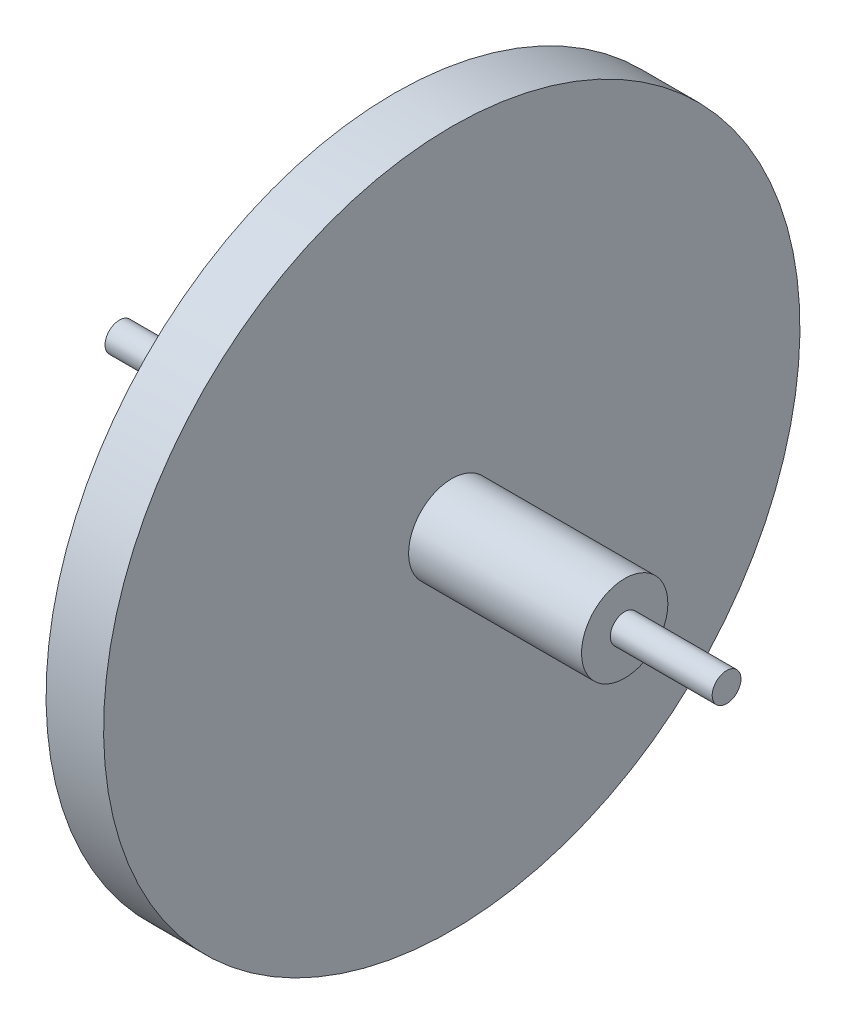
ISO-10303-21;
HEADER;
FILE_DESCRIPTION(('STEP AP214'),'2;1');
FILE_NAME('part.step','',(''),(''),'','','');
FILE_SCHEMA(('AUTOMOTIVE_DESIGN { 1 0 10303 214 1 1 1 1 }'));
ENDSEC;
DATA;
#1=APPLICATION_CONTEXT('core data for automotive mechanical design processes');
#2=APPLICATION_PROTOCOL_DEFINITION('international standard','automotive_design',2000,#1);
#3=PRODUCT_CONTEXT('',#1,'mechanical');
#4=PRODUCT('Part','Part','',(#3));
#5=PRODUCT_RELATED_PRODUCT_CATEGORY('part','',(#4));
#6=PRODUCT_DEFINITION_FORMATION('','',#4);
#7=PRODUCT_DEFINITION_CONTEXT('part definition',#1,'design');
#8=PRODUCT_DEFINITION('design','',#6,#7);
#9=PRODUCT_DEFINITION_SHAPE('','',#8);
#10=(LENGTH_UNIT() NAMED_UNIT(*) SI_UNIT(.MILLI.,.METRE.));
#11=(NAMED_UNIT(*) PLANE_ANGLE_UNIT() SI_UNIT($,.RADIAN.));
#12=(NAMED_UNIT(*) SI_UNIT($,.STERADIAN.) SOLID_ANGLE_UNIT());
#13=UNCERTAINTY_MEASURE_WITH_UNIT(LENGTH_MEASURE(1.E-05),#10,'distance_accuracy_value','');
#14=(GEOMETRIC_REPRESENTATION_CONTEXT(3) GLOBAL_UNCERTAINTY_ASSIGNED_CONTEXT((#13)) GLOBAL_UNIT_ASSIGNED_CONTEXT((#10,
#11,#12)) REPRESENTATION_CONTEXT('',''));
#15=CARTESIAN_POINT('',(0.,0.,0.));
#16=DIRECTION('',(0.,0.,1.));
#17=DIRECTION('',(1.,0.,0.));
#18=AXIS2_PLACEMENT_3D('',#15,#16,#17);
#19=CARTESIAN_POINT('',(9.99999999999999,121.,0.));
#20=DIRECTION('',(-1.,0.,0.));
#21=DIRECTION('',(0.,-1.,0.));
#22=AXIS2_PLACEMENT_3D('',#19,#20,#21);
#23=PLANE('',#22);
#24=CARTESIAN_POINT('',(9.99999999999999,0.,0.));
#25=DIRECTION('',(1.,0.,0.));
#26=DIRECTION('',(0.,1.,0.));
#27=AXIS2_PLACEMENT_3D('',#24,#25,#26);
#28=CIRCLE('',#27,15.);
#29=CARTESIAN_POINT('',(9.99999999999999,15.,0.));
#30=VERTEX_POINT('',#29);
#31=EDGE_CURVE('E86',#30,#30,#28,.T.);
#32=ORIENTED_EDGE('',*,*,#31,.F.);
#33=EDGE_LOOP('',(#32));
#34=FACE_BOUND('',#33,.T.);
#35=CARTESIAN_POINT('',(10.,0.,0.));
#36=DIRECTION('',(1.,0.,0.));
#37=DIRECTION('',(0.,1.,0.));
#38=AXIS2_PLACEMENT_3D('',#35,#36,#37);
#39=CIRCLE('',#38,121.);
#40=CARTESIAN_POINT('',(10.,121.,0.));
#41=VERTEX_POINT('',#40);
#42=EDGE_CURVE('E10',#41,#41,#39,.T.);
#43=ORIENTED_EDGE('',*,*,#42,.T.);
#44=EDGE_LOOP('',(#43));
#45=FACE_BOUND('',#44,.T.);
#46=ADVANCED_FACE('F43',(#34,#45),#23,.F.);
#47=CARTESIAN_POINT('',(105.5,0.,0.));
#48=DIRECTION('',(1.,0.,0.));
#49=DIRECTION('',(0.,1.,0.));
#50=AXIS2_PLACEMENT_3D('',#47,#48,#49);
#51=CYLINDRICAL_SURFACE('',#50,121.);
#52=ORIENTED_EDGE('',*,*,#42,.F.);
#53=EDGE_LOOP('',(#52));
#54=FACE_BOUND('',#53,.T.);
#55=CARTESIAN_POINT('',(-9.99999999999997,0.,0.));
#56=DIRECTION('',(1.,0.,0.));
#57=DIRECTION('',(0.,1.,0.));
#58=AXIS2_PLACEMENT_3D('',#55,#56,#57);
#59=CIRCLE('',#58,121.);
#60=CARTESIAN_POINT('',(-9.99999999999999,121.,0.));
#61=VERTEX_POINT('',#60);
#62=EDGE_CURVE('E50',#61,#61,#59,.T.);
#63=ORIENTED_EDGE('',*,*,#62,.T.);
#64=EDGE_LOOP('',(#63));
#65=FACE_BOUND('',#64,.T.);
#66=ADVANCED_FACE('F94',(#54,#65),#51,.T.);
#67=CARTESIAN_POINT('',(-9.99999999999999,10.,0.));
#68=DIRECTION('',(1.,0.,0.));
#69=DIRECTION('',(0.,1.,0.));
#70=AXIS2_PLACEMENT_3D('',#67,#68,#69);
#71=PLANE('',#70);
#72=ORIENTED_EDGE('',*,*,#62,.F.);
#73=EDGE_LOOP('',(#72));
#74=FACE_BOUND('',#73,.T.);
#75=CARTESIAN_POINT('',(-9.99999999999999,0.,0.));
#76=DIRECTION('',(1.,0.,0.));
#77=DIRECTION('',(0.,1.,0.));
#78=AXIS2_PLACEMENT_3D('',#75,#76,#77);
#79=CIRCLE('',#78,9.99999999999998);
#80=CARTESIAN_POINT('',(-10.,10.,0.));
#81=VERTEX_POINT('',#80);
#82=EDGE_CURVE('E55',#81,#81,#79,.T.);
#83=ORIENTED_EDGE('',*,*,#82,.T.);
#84=EDGE_LOOP('',(#83));
#85=FACE_BOUND('',#84,.T.);
#86=ADVANCED_FACE('F98',(#74,#85),#71,.F.);
#87=CARTESIAN_POINT('',(105.5,0.,0.));
#88=DIRECTION('',(1.,0.,0.));
#89=DIRECTION('',(0.,1.,0.));
#90=AXIS2_PLACEMENT_3D('',#87,#88,#89);
#91=CYLINDRICAL_SURFACE('',#90,9.99999999999999);
#92=ORIENTED_EDGE('',*,*,#82,.F.);
#93=EDGE_LOOP('',(#92));
#94=FACE_BOUND('',#93,.T.);
#95=CARTESIAN_POINT('',(-64.9072851720996,0.,0.));
#96=DIRECTION('',(1.,0.,0.));
#97=DIRECTION('',(0.,1.,0.));
#98=AXIS2_PLACEMENT_3D('',#95,#96,#97);
#99=CIRCLE('',#98,9.99999999999999);
#100=CARTESIAN_POINT('',(-64.9072851720996,10.,0.));
#101=VERTEX_POINT('',#100);
#102=EDGE_CURVE('E60',#101,#101,#99,.T.);
#103=ORIENTED_EDGE('',*,*,#102,.T.);
#104=EDGE_LOOP('',(#103));
#105=FACE_BOUND('',#104,.T.);
#106=ADVANCED_FACE('F103',(#94,#105),#91,.T.);
#107=CARTESIAN_POINT('',(-64.9072851720996,5.,0.));
#108=DIRECTION('',(1.,0.,0.));
#109=DIRECTION('',(0.,1.,0.));
#110=AXIS2_PLACEMENT_3D('',#107,#108,#109);
#111=PLANE('',#110);
#112=ORIENTED_EDGE('',*,*,#102,.F.);
#113=EDGE_LOOP('',(#112));
#114=FACE_BOUND('',#113,.T.);
#115=CARTESIAN_POINT('',(-64.9072851720996,0.,0.));
#116=DIRECTION('',(1.,0.,0.));
#117=DIRECTION('',(0.,1.,0.));
#118=AXIS2_PLACEMENT_3D('',#115,#116,#117);
#119=CIRCLE('',#118,4.99999999999999);
#120=CARTESIAN_POINT('',(-64.9072851720996,5.,0.));
#121=VERTEX_POINT('',#120);
#122=EDGE_CURVE('E66',#121,#121,#119,.T.);
#123=ORIENTED_EDGE('',*,*,#122,.T.);
#124=EDGE_LOOP('',(#123));
#125=FACE_BOUND('',#124,.T.);
#126=ADVANCED_FACE('F109',(#114,#125),#111,.F.);
#127=CARTESIAN_POINT('',(105.5,0.,0.));
#128=DIRECTION('',(1.,0.,0.));
#129=DIRECTION('',(0.,1.,0.));
#130=AXIS2_PLACEMENT_3D('',#127,#128,#129);
#131=CYLINDRICAL_SURFACE('',#130,5.);
#132=ORIENTED_EDGE('',*,*,#122,.F.);
#133=EDGE_LOOP('',(#132));
#134=FACE_BOUND('',#133,.T.);
#135=CARTESIAN_POINT('',(-105.5,0.,0.));
#136=DIRECTION('',(1.,0.,0.));
#137=DIRECTION('',(0.,1.,0.));
#138=AXIS2_PLACEMENT_3D('',#135,#136,#137);
#139=CIRCLE('',#138,5.);
#140=CARTESIAN_POINT('',(-105.5,5.,0.));
#141=VERTEX_POINT('',#140);
#142=EDGE_CURVE('E70',#141,#141,#139,.T.);
#143=ORIENTED_EDGE('',*,*,#142,.T.);
#144=EDGE_LOOP('',(#143));
#145=FACE_BOUND('',#144,.T.);
#146=ADVANCED_FACE('F113',(#134,#145),#131,.T.);
#147=CARTESIAN_POINT('',(-105.5,0.,0.));
#148=DIRECTION('',(1.,0.,0.));
#149=DIRECTION('',(0.,1.,0.));
#150=AXIS2_PLACEMENT_3D('',#147,#148,#149);
#151=PLANE('',#150);
#152=ORIENTED_EDGE('',*,*,#142,.F.);
#153=EDGE_LOOP('',(#152));
#154=FACE_BOUND('',#153,.T.);
#155=ADVANCED_FACE('F117',(#154),#151,.F.);
#156=CARTESIAN_POINT('',(105.5,5.00000000000004,0.));
#157=DIRECTION('',(-1.,0.,0.));
#158=DIRECTION('',(0.,-1.,0.));
#159=AXIS2_PLACEMENT_3D('',#156,#157,#158);
#160=PLANE('',#159);
#161=CARTESIAN_POINT('',(105.5,0.,0.));
#162=DIRECTION('',(1.,0.,0.));
#163=DIRECTION('',(0.,1.,0.));
#164=AXIS2_PLACEMENT_3D('',#161,#162,#163);
#165=CIRCLE('',#164,5.);
#166=CARTESIAN_POINT('',(105.5,5.00000000000004,0.));
#167=VERTEX_POINT('',#166);
#168=EDGE_CURVE('E74',#167,#167,#165,.T.);
#169=ORIENTED_EDGE('',*,*,#168,.T.);
#170=EDGE_LOOP('',(#169));
#171=FACE_BOUND('',#170,.T.);
#172=ADVANCED_FACE('F121',(#171),#160,.F.);
#173=CARTESIAN_POINT('',(105.5,0.,0.));
#174=DIRECTION('',(1.,0.,0.));
#175=DIRECTION('',(0.,1.,0.));
#176=AXIS2_PLACEMENT_3D('',#173,#174,#175);
#177=CYLINDRICAL_SURFACE('',#176,4.99999999999998);
#178=ORIENTED_EDGE('',*,*,#168,.F.);
#179=EDGE_LOOP('',(#178));
#180=FACE_BOUND('',#179,.T.);
#181=CARTESIAN_POINT('',(70.0927148279004,0.,0.));
#182=DIRECTION('',(1.,0.,0.));
#183=DIRECTION('',(0.,1.,0.));
#184=AXIS2_PLACEMENT_3D('',#181,#182,#183);
#185=CIRCLE('',#184,4.99999999999997);
#186=CARTESIAN_POINT('',(70.0927148279004,5.,0.));
#187=VERTEX_POINT('',#186);
#188=EDGE_CURVE('E78',#187,#187,#185,.T.);
#189=ORIENTED_EDGE('',*,*,#188,.T.);
#190=EDGE_LOOP('',(#189));
#191=FACE_BOUND('',#190,.T.);
#192=ADVANCED_FACE('F125',(#180,#191),#177,.T.);
#193=CARTESIAN_POINT('',(70.0927148279004,15.,0.));
#194=DIRECTION('',(-1.,0.,0.));
#195=DIRECTION('',(0.,-1.,0.));
#196=AXIS2_PLACEMENT_3D('',#193,#194,#195);
#197=PLANE('',#196);
#198=ORIENTED_EDGE('',*,*,#188,.F.);
#199=EDGE_LOOP('',(#198));
#200=FACE_BOUND('',#199,.T.);
#201=CARTESIAN_POINT('',(70.0927148279004,0.,0.));
#202=DIRECTION('',(1.,0.,0.));
#203=DIRECTION('',(0.,1.,0.));
#204=AXIS2_PLACEMENT_3D('',#201,#202,#203);
#205=CIRCLE('',#204,15.);
#206=CARTESIAN_POINT('',(70.0927148279004,15.,0.));
#207=VERTEX_POINT('',#206);
#208=EDGE_CURVE('E82',#207,#207,#205,.T.);
#209=ORIENTED_EDGE('',*,*,#208,.T.);
#210=EDGE_LOOP('',(#209));
#211=FACE_BOUND('',#210,.T.);
#212=ADVANCED_FACE('F129',(#200,#211),#197,.F.);
#213=CARTESIAN_POINT('',(105.5,0.,0.));
#214=DIRECTION('',(1.,0.,0.));
#215=DIRECTION('',(0.,1.,0.));
#216=AXIS2_PLACEMENT_3D('',#213,#214,#215);
#217=CYLINDRICAL_SURFACE('',#216,15.);
#218=ORIENTED_EDGE('',*,*,#208,.F.);
#219=EDGE_LOOP('',(#218));
#220=FACE_BOUND('',#219,.T.);
#221=ORIENTED_EDGE('',*,*,#31,.T.);
#222=EDGE_LOOP('',(#221));
#223=FACE_BOUND('',#222,.T.);
#224=ADVANCED_FACE('F91',(#220,#223),#217,.T.);
#225=CLOSED_SHELL('',(#46,#66,#86,#106,#126,#146,#155,#172,#192,#212,#224));
#226=MANIFOLD_SOLID_BREP('B2',#225);
#227=ADVANCED_BREP_SHAPE_REPRESENTATION('',(#18,#226),#14);
#228=SHAPE_DEFINITION_REPRESENTATION(#9,#227);
ENDSEC;
END-ISO-10303-21;
